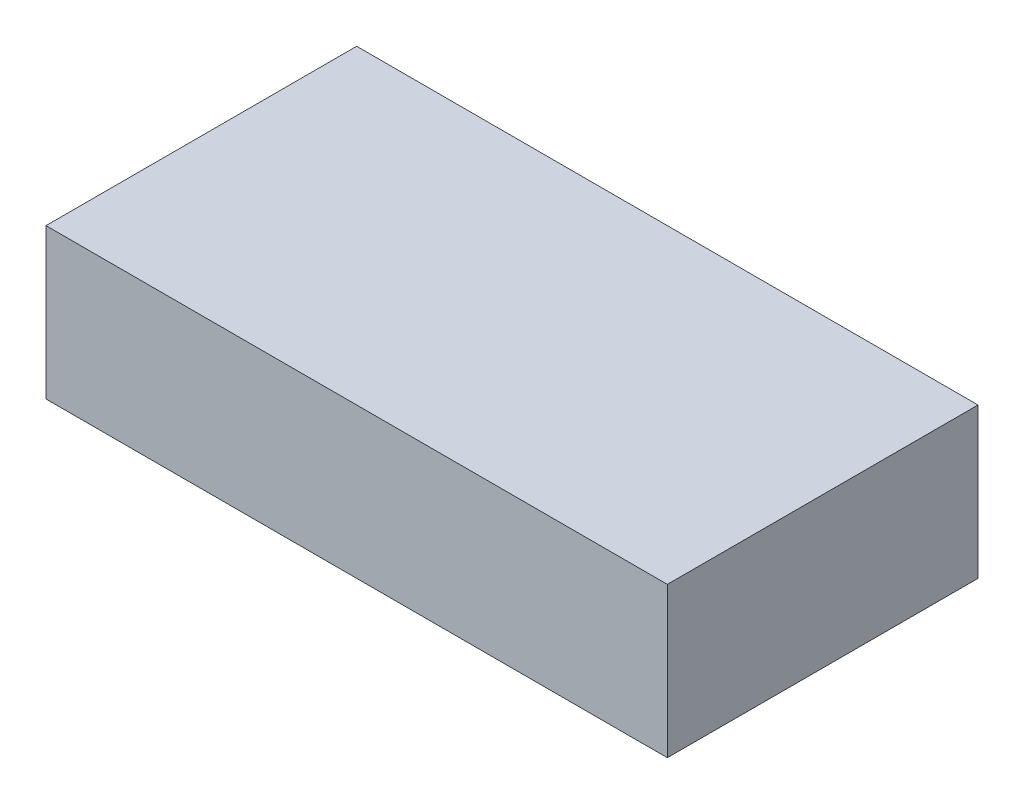
ISO-10303-21;
HEADER;
FILE_DESCRIPTION(('STEP AP214'),'2;1');
FILE_NAME('part.step','',(''),(''),'','','');
FILE_SCHEMA(('AUTOMOTIVE_DESIGN { 1 0 10303 214 1 1 1 1 }'));
ENDSEC;
DATA;
#1=APPLICATION_CONTEXT('core data for automotive mechanical design processes');
#2=APPLICATION_PROTOCOL_DEFINITION('international standard','automotive_design',2000,#1);
#3=PRODUCT_CONTEXT('',#1,'mechanical');
#4=PRODUCT('Part','Part','',(#3));
#5=PRODUCT_RELATED_PRODUCT_CATEGORY('part','',(#4));
#6=PRODUCT_DEFINITION_FORMATION('','',#4);
#7=PRODUCT_DEFINITION_CONTEXT('part definition',#1,'design');
#8=PRODUCT_DEFINITION('design','',#6,#7);
#9=PRODUCT_DEFINITION_SHAPE('','',#8);
#10=(LENGTH_UNIT() NAMED_UNIT(*) SI_UNIT(.MILLI.,.METRE.));
#11=(NAMED_UNIT(*) PLANE_ANGLE_UNIT() SI_UNIT($,.RADIAN.));
#12=(NAMED_UNIT(*) SI_UNIT($,.STERADIAN.) SOLID_ANGLE_UNIT());
#13=UNCERTAINTY_MEASURE_WITH_UNIT(LENGTH_MEASURE(1.E-05),#10,'distance_accuracy_value','');
#14=(GEOMETRIC_REPRESENTATION_CONTEXT(3) GLOBAL_UNCERTAINTY_ASSIGNED_CONTEXT((#13)) GLOBAL_UNIT_ASSIGNED_CONTEXT((#10,
#11,#12)) REPRESENTATION_CONTEXT('',''));
#15=CARTESIAN_POINT('',(0.,0.,0.));
#16=DIRECTION('',(0.,0.,1.));
#17=DIRECTION('',(1.,0.,0.));
#18=AXIS2_PLACEMENT_3D('',#15,#16,#17);
#19=CARTESIAN_POINT('',(0.,14.5,0.));
#20=DIRECTION('',(1.,0.,0.));
#21=DIRECTION('',(0.,0.,-1.));
#22=AXIS2_PLACEMENT_3D('',#19,#20,#21);
#23=PLANE('',#22);
#24=DIRECTION('',(0.,0.,1.));
#25=VECTOR('',#24,1.);
#26=CARTESIAN_POINT('',(0.,0.,0.));
#27=LINE('',#26,#25);
#28=CARTESIAN_POINT('',(0.,0.,-30.));
#29=VERTEX_POINT('',#28);
#30=CARTESIAN_POINT('',(0.,0.,0.));
#31=VERTEX_POINT('',#30);
#32=EDGE_CURVE('E102',#29,#31,#27,.T.);
#33=ORIENTED_EDGE('',*,*,#32,.T.);
#34=DIRECTION('',(0.,-1.,0.));
#35=VECTOR('',#34,1.);
#36=CARTESIAN_POINT('',(0.,14.5,0.));
#37=LINE('',#36,#35);
#38=CARTESIAN_POINT('',(0.,14.5,0.));
#39=VERTEX_POINT('',#38);
#40=EDGE_CURVE('E11',#39,#31,#37,.T.);
#41=ORIENTED_EDGE('',*,*,#40,.F.);
#42=DIRECTION('',(0.,0.,1.));
#43=VECTOR('',#42,1.);
#44=CARTESIAN_POINT('',(0.,14.5,0.));
#45=LINE('',#44,#43);
#46=CARTESIAN_POINT('',(0.,14.5,-30.));
#47=VERTEX_POINT('',#46);
#48=EDGE_CURVE('E90',#47,#39,#45,.T.);
#49=ORIENTED_EDGE('',*,*,#48,.F.);
#50=DIRECTION('',(0.,-1.,0.));
#51=VECTOR('',#50,1.);
#52=CARTESIAN_POINT('',(0.,14.5,-30.));
#53=LINE('',#52,#51);
#54=EDGE_CURVE('E98',#47,#29,#53,.T.);
#55=ORIENTED_EDGE('',*,*,#54,.T.);
#56=EDGE_LOOP('',(#33,#41,#49,#55));
#57=FACE_BOUND('',#56,.T.);
#58=ADVANCED_FACE('F39',(#57),#23,.F.);
#59=CARTESIAN_POINT('',(0.,14.5,0.));
#60=DIRECTION('',(0.,0.,-1.));
#61=DIRECTION('',(-1.,0.,0.));
#62=AXIS2_PLACEMENT_3D('',#59,#60,#61);
#63=PLANE('',#62);
#64=DIRECTION('',(1.,0.,0.));
#65=VECTOR('',#64,1.);
#66=CARTESIAN_POINT('',(0.,0.,0.));
#67=LINE('',#66,#65);
#68=CARTESIAN_POINT('',(60.,0.,0.));
#69=VERTEX_POINT('',#68);
#70=EDGE_CURVE('E94',#31,#69,#67,.T.);
#71=ORIENTED_EDGE('',*,*,#70,.T.);
#72=DIRECTION('',(0.,-1.,0.));
#73=VECTOR('',#72,1.);
#74=CARTESIAN_POINT('',(60.,14.5,0.));
#75=LINE('',#74,#73);
#76=CARTESIAN_POINT('',(60.,14.5,0.));
#77=VERTEX_POINT('',#76);
#78=EDGE_CURVE('E47',#77,#69,#75,.T.);
#79=ORIENTED_EDGE('',*,*,#78,.F.);
#80=DIRECTION('',(1.,0.,0.));
#81=VECTOR('',#80,1.);
#82=CARTESIAN_POINT('',(0.,14.5,0.));
#83=LINE('',#82,#81);
#84=EDGE_CURVE('E85',#39,#77,#83,.T.);
#85=ORIENTED_EDGE('',*,*,#84,.F.);
#86=ORIENTED_EDGE('',*,*,#40,.T.);
#87=EDGE_LOOP('',(#71,#79,#85,#86));
#88=FACE_BOUND('',#87,.T.);
#89=ADVANCED_FACE('F93',(#88),#63,.F.);
#90=CARTESIAN_POINT('',(60.,14.5,0.));
#91=DIRECTION('',(-1.,0.,0.));
#92=DIRECTION('',(0.,0.,1.));
#93=AXIS2_PLACEMENT_3D('',#90,#91,#92);
#94=PLANE('',#93);
#95=DIRECTION('',(0.,0.,-1.));
#96=VECTOR('',#95,1.);
#97=CARTESIAN_POINT('',(60.,0.,0.));
#98=LINE('',#97,#96);
#99=CARTESIAN_POINT('',(60.,0.,-30.));
#100=VERTEX_POINT('',#99);
#101=EDGE_CURVE('E72',#69,#100,#98,.T.);
#102=ORIENTED_EDGE('',*,*,#101,.T.);
#103=DIRECTION('',(0.,-1.,0.));
#104=VECTOR('',#103,1.);
#105=CARTESIAN_POINT('',(60.,14.5,-30.));
#106=LINE('',#105,#104);
#107=CARTESIAN_POINT('',(60.,14.5,-30.));
#108=VERTEX_POINT('',#107);
#109=EDGE_CURVE('E95',#108,#100,#106,.T.);
#110=ORIENTED_EDGE('',*,*,#109,.F.);
#111=DIRECTION('',(0.,0.,-1.));
#112=VECTOR('',#111,1.);
#113=CARTESIAN_POINT('',(60.,14.5,0.));
#114=LINE('',#113,#112);
#115=EDGE_CURVE('E88',#77,#108,#114,.T.);
#116=ORIENTED_EDGE('',*,*,#115,.F.);
#117=ORIENTED_EDGE('',*,*,#78,.T.);
#118=EDGE_LOOP('',(#102,#110,#116,#117));
#119=FACE_BOUND('',#118,.T.);
#120=ADVANCED_FACE('F96',(#119),#94,.F.);
#121=CARTESIAN_POINT('',(0.,14.5,-30.));
#122=DIRECTION('',(0.,0.,1.));
#123=DIRECTION('',(1.,0.,0.));
#124=AXIS2_PLACEMENT_3D('',#121,#122,#123);
#125=PLANE('',#124);
#126=DIRECTION('',(-1.,0.,0.));
#127=VECTOR('',#126,1.);
#128=CARTESIAN_POINT('',(0.,0.,-30.));
#129=LINE('',#128,#127);
#130=EDGE_CURVE('E78',#100,#29,#129,.T.);
#131=ORIENTED_EDGE('',*,*,#130,.T.);
#132=ORIENTED_EDGE('',*,*,#54,.F.);
#133=DIRECTION('',(-1.,0.,0.));
#134=VECTOR('',#133,1.);
#135=CARTESIAN_POINT('',(0.,14.5,-30.));
#136=LINE('',#135,#134);
#137=EDGE_CURVE('E55',#108,#47,#136,.T.);
#138=ORIENTED_EDGE('',*,*,#137,.F.);
#139=ORIENTED_EDGE('',*,*,#109,.T.);
#140=EDGE_LOOP('',(#131,#132,#138,#139));
#141=FACE_BOUND('',#140,.T.);
#142=ADVANCED_FACE('F109',(#141),#125,.F.);
#143=CARTESIAN_POINT('',(0.,14.5,0.));
#144=DIRECTION('',(0.,-1.,0.));
#145=DIRECTION('',(0.,0.,-1.));
#146=AXIS2_PLACEMENT_3D('',#143,#144,#145);
#147=PLANE('',#146);
#148=ORIENTED_EDGE('',*,*,#48,.T.);
#149=ORIENTED_EDGE('',*,*,#84,.T.);
#150=ORIENTED_EDGE('',*,*,#115,.T.);
#151=ORIENTED_EDGE('',*,*,#137,.T.);
#152=EDGE_LOOP('',(#148,#149,#150,#151));
#153=FACE_BOUND('',#152,.T.);
#154=ADVANCED_FACE('F86',(#153),#147,.F.);
#155=CARTESIAN_POINT('',(0.,0.,0.));
#156=DIRECTION('',(0.,-1.,0.));
#157=DIRECTION('',(0.,0.,-1.));
#158=AXIS2_PLACEMENT_3D('',#155,#156,#157);
#159=PLANE('',#158);
#160=ORIENTED_EDGE('',*,*,#32,.F.);
#161=ORIENTED_EDGE('',*,*,#130,.F.);
#162=ORIENTED_EDGE('',*,*,#101,.F.);
#163=ORIENTED_EDGE('',*,*,#70,.F.);
#164=EDGE_LOOP('',(#160,#161,#162,#163));
#165=FACE_BOUND('',#164,.T.);
#166=ADVANCED_FACE('F112',(#165),#159,.T.);
#167=CLOSED_SHELL('',(#58,#89,#120,#142,#154,#166));
#168=MANIFOLD_SOLID_BREP('B2',#167);
#169=ADVANCED_BREP_SHAPE_REPRESENTATION('',(#18,#168),#14);
#170=SHAPE_DEFINITION_REPRESENTATION(#9,#169);
ENDSEC;
END-ISO-10303-21;
